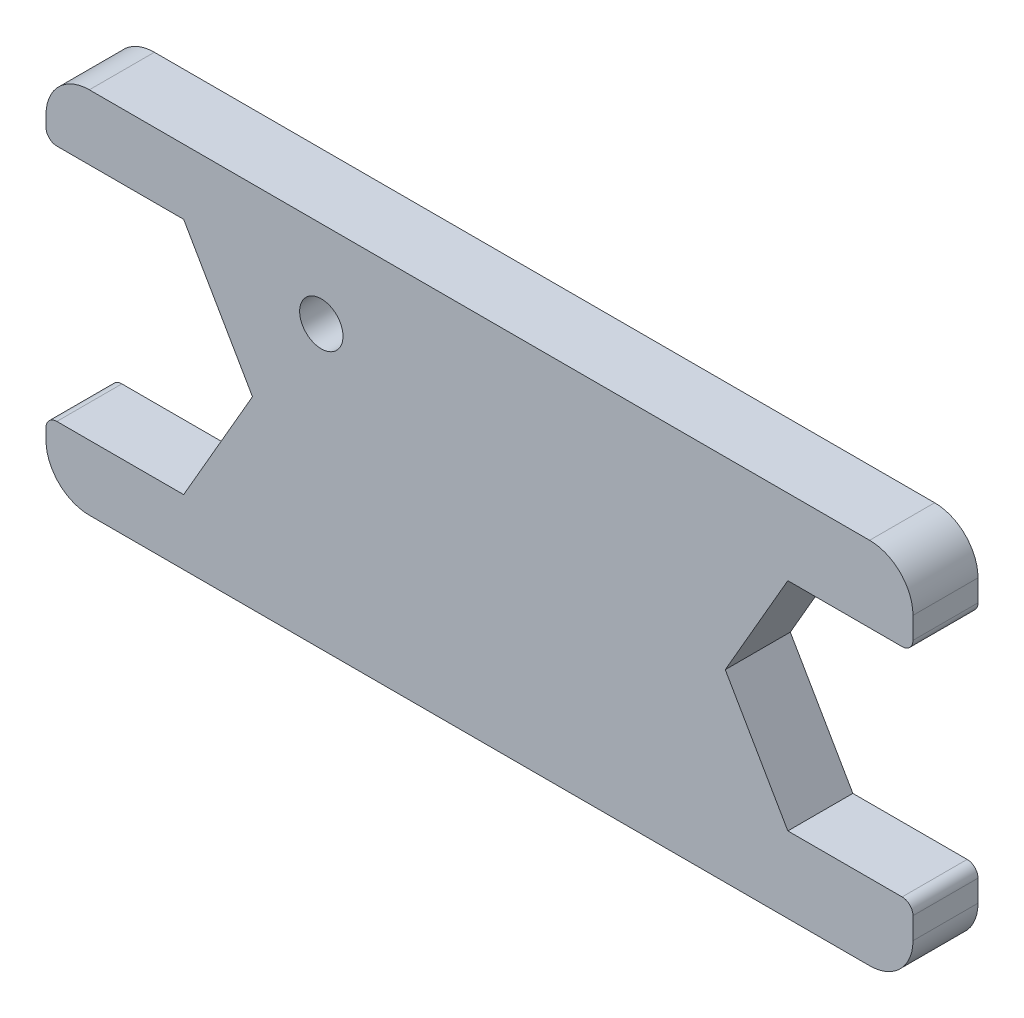
ISO-10303-21;
HEADER;
FILE_DESCRIPTION(('STEP AP214'),'2;1');
FILE_NAME('part.step','',(''),(''),'','','');
FILE_SCHEMA(('AUTOMOTIVE_DESIGN { 1 0 10303 214 1 1 1 1 }'));
ENDSEC;
DATA;
#1=APPLICATION_CONTEXT('core data for automotive mechanical design processes');
#2=APPLICATION_PROTOCOL_DEFINITION('international standard','automotive_design',2000,#1);
#3=PRODUCT_CONTEXT('',#1,'mechanical');
#4=PRODUCT('Part','Part','',(#3));
#5=PRODUCT_RELATED_PRODUCT_CATEGORY('part','',(#4));
#6=PRODUCT_DEFINITION_FORMATION('','',#4);
#7=PRODUCT_DEFINITION_CONTEXT('part definition',#1,'design');
#8=PRODUCT_DEFINITION('design','',#6,#7);
#9=PRODUCT_DEFINITION_SHAPE('','',#8);
#10=(LENGTH_UNIT() NAMED_UNIT(*) SI_UNIT(.MILLI.,.METRE.));
#11=(NAMED_UNIT(*) PLANE_ANGLE_UNIT() SI_UNIT($,.RADIAN.));
#12=(NAMED_UNIT(*) SI_UNIT($,.STERADIAN.) SOLID_ANGLE_UNIT());
#13=UNCERTAINTY_MEASURE_WITH_UNIT(LENGTH_MEASURE(1.E-05),#10,'distance_accuracy_value','');
#14=(GEOMETRIC_REPRESENTATION_CONTEXT(3) GLOBAL_UNCERTAINTY_ASSIGNED_CONTEXT((#13)) GLOBAL_UNIT_ASSIGNED_CONTEXT((#10,
#11,#12)) REPRESENTATION_CONTEXT('',''));
#15=CARTESIAN_POINT('',(0.,0.,0.));
#16=DIRECTION('',(0.,0.,1.));
#17=DIRECTION('',(1.,0.,0.));
#18=AXIS2_PLACEMENT_3D('',#15,#16,#17);
#19=CARTESIAN_POINT('',(0.,-5.,3.));
#20=DIRECTION('',(0.,1.,0.));
#21=DIRECTION('',(-1.,0.,0.));
#22=AXIS2_PLACEMENT_3D('',#19,#20,#21);
#23=PLANE('',#22);
#24=DIRECTION('',(1.,0.,0.));
#25=VECTOR('',#24,1.);
#26=CARTESIAN_POINT('',(0.,-5.,3.));
#27=LINE('',#26,#25);
#28=CARTESIAN_POINT('',(31.0510708275608,-5.,3.));
#29=VERTEX_POINT('',#28);
#30=CARTESIAN_POINT('',(36.3245735194571,-5.,3.));
#31=VERTEX_POINT('',#30);
#32=EDGE_CURVE('E199',#29,#31,#27,.T.);
#33=ORIENTED_EDGE('',*,*,#32,.T.);
#34=DIRECTION('',(0.,0.,-1.));
#35=VECTOR('',#34,1.);
#36=CARTESIAN_POINT('',(36.3245735194571,-5.,0.));
#37=LINE('',#36,#35);
#38=CARTESIAN_POINT('',(36.3245735194571,-5.,0.));
#39=VERTEX_POINT('',#38);
#40=EDGE_CURVE('E208',#31,#39,#37,.T.);
#41=ORIENTED_EDGE('',*,*,#40,.T.);
#42=DIRECTION('',(1.,0.,0.));
#43=VECTOR('',#42,1.);
#44=CARTESIAN_POINT('',(0.,-5.,0.));
#45=LINE('',#44,#43);
#46=CARTESIAN_POINT('',(31.0510708275608,-5.,0.));
#47=VERTEX_POINT('',#46);
#48=EDGE_CURVE('E202',#47,#39,#45,.T.);
#49=ORIENTED_EDGE('',*,*,#48,.F.);
#50=DIRECTION('',(0.,0.,-1.));
#51=VECTOR('',#50,1.);
#52=CARTESIAN_POINT('',(31.0510708275608,-5.,3.));
#53=LINE('',#52,#51);
#54=EDGE_CURVE('E196',#29,#47,#53,.T.);
#55=ORIENTED_EDGE('',*,*,#54,.F.);
#56=EDGE_LOOP('',(#33,#41,#49,#55));
#57=FACE_BOUND('',#56,.T.);
#58=ADVANCED_FACE('F45',(#57),#23,.T.);
#59=CARTESIAN_POINT('',(21.1232396112095,12.1955080756888,3.));
#60=DIRECTION('',(0.866025403784439,0.5,0.));
#61=DIRECTION('',(-0.5,0.866025403784439,0.));
#62=AXIS2_PLACEMENT_3D('',#59,#60,#61);
#63=PLANE('',#62);
#64=DIRECTION('',(0.5,-0.866025403784439,0.));
#65=VECTOR('',#64,1.);
#66=CARTESIAN_POINT('',(21.1232396112095,12.1955080756888,0.));
#67=LINE('',#66,#65);
#68=CARTESIAN_POINT('',(28.1643194816127,0.,0.));
#69=VERTEX_POINT('',#68);
#70=EDGE_CURVE('E266',#69,#47,#67,.T.);
#71=ORIENTED_EDGE('',*,*,#70,.F.);
#72=DIRECTION('',(0.,0.,-1.));
#73=VECTOR('',#72,1.);
#74=CARTESIAN_POINT('',(28.1643194816127,0.,3.));
#75=LINE('',#74,#73);
#76=CARTESIAN_POINT('',(28.1643194816127,0.,3.));
#77=VERTEX_POINT('',#76);
#78=EDGE_CURVE('E209',#77,#69,#75,.T.);
#79=ORIENTED_EDGE('',*,*,#78,.F.);
#80=DIRECTION('',(0.5,-0.866025403784439,0.));
#81=VECTOR('',#80,1.);
#82=CARTESIAN_POINT('',(21.1232396112095,12.1955080756888,3.));
#83=LINE('',#82,#81);
#84=EDGE_CURVE('E215',#77,#29,#83,.T.);
#85=ORIENTED_EDGE('',*,*,#84,.T.);
#86=ORIENTED_EDGE('',*,*,#54,.T.);
#87=EDGE_LOOP('',(#71,#79,#85,#86));
#88=FACE_BOUND('',#87,.T.);
#89=ADVANCED_FACE('F222',(#88),#63,.T.);
#90=CARTESIAN_POINT('',(21.1232396112095,-12.1955080756888,3.));
#91=DIRECTION('',(0.866025403784439,-0.5,0.));
#92=DIRECTION('',(0.5,0.866025403784439,0.));
#93=AXIS2_PLACEMENT_3D('',#90,#91,#92);
#94=PLANE('',#93);
#95=DIRECTION('',(-0.5,-0.866025403784439,0.));
#96=VECTOR('',#95,1.);
#97=CARTESIAN_POINT('',(21.1232396112095,-12.1955080756888,0.));
#98=LINE('',#97,#96);
#99=CARTESIAN_POINT('',(31.0510708275608,4.99999999999999,0.));
#100=VERTEX_POINT('',#99);
#101=EDGE_CURVE('E270',#100,#69,#98,.T.);
#102=ORIENTED_EDGE('',*,*,#101,.F.);
#103=DIRECTION('',(0.,0.,-1.));
#104=VECTOR('',#103,1.);
#105=CARTESIAN_POINT('',(31.0510708275608,4.99999999999999,3.));
#106=LINE('',#105,#104);
#107=CARTESIAN_POINT('',(31.0510708275608,4.99999999999999,3.));
#108=VERTEX_POINT('',#107);
#109=EDGE_CURVE('E319',#108,#100,#106,.T.);
#110=ORIENTED_EDGE('',*,*,#109,.F.);
#111=DIRECTION('',(-0.5,-0.866025403784439,0.));
#112=VECTOR('',#111,1.);
#113=CARTESIAN_POINT('',(21.1232396112095,-12.1955080756888,3.));
#114=LINE('',#113,#112);
#115=EDGE_CURVE('E224',#108,#77,#114,.T.);
#116=ORIENTED_EDGE('',*,*,#115,.T.);
#117=ORIENTED_EDGE('',*,*,#78,.T.);
#118=EDGE_LOOP('',(#102,#110,#116,#117));
#119=FACE_BOUND('',#118,.T.);
#120=ADVANCED_FACE('F464',(#119),#94,.T.);
#121=CARTESIAN_POINT('',(0.,4.99999999999999,3.));
#122=DIRECTION('',(0.,-1.,0.));
#123=DIRECTION('',(0.,0.,-1.));
#124=AXIS2_PLACEMENT_3D('',#121,#122,#123);
#125=PLANE('',#124);
#126=DIRECTION('',(-1.,0.,0.));
#127=VECTOR('',#126,1.);
#128=CARTESIAN_POINT('',(0.,4.99999999999999,0.));
#129=LINE('',#128,#127);
#130=CARTESIAN_POINT('',(36.3245735194571,4.99999999999999,0.));
#131=VERTEX_POINT('',#130);
#132=EDGE_CURVE('E274',#131,#100,#129,.T.);
#133=ORIENTED_EDGE('',*,*,#132,.F.);
#134=DIRECTION('',(0.,0.,-1.));
#135=VECTOR('',#134,1.);
#136=CARTESIAN_POINT('',(36.3245735194571,4.99999999999999,3.));
#137=LINE('',#136,#135);
#138=CARTESIAN_POINT('',(36.3245735194571,4.99999999999999,3.));
#139=VERTEX_POINT('',#138);
#140=EDGE_CURVE('E360',#131,#139,#137,.F.);
#141=ORIENTED_EDGE('',*,*,#140,.T.);
#142=DIRECTION('',(-1.,0.,0.));
#143=VECTOR('',#142,1.);
#144=CARTESIAN_POINT('',(0.,4.99999999999999,3.));
#145=LINE('',#144,#143);
#146=EDGE_CURVE('E227',#139,#108,#145,.T.);
#147=ORIENTED_EDGE('',*,*,#146,.T.);
#148=ORIENTED_EDGE('',*,*,#109,.T.);
#149=EDGE_LOOP('',(#133,#141,#147,#148));
#150=FACE_BOUND('',#149,.T.);
#151=ADVANCED_FACE('F546',(#150),#125,.T.);
#152=CARTESIAN_POINT('',(36.8245735194571,0.,3.));
#153=DIRECTION('',(-1.,0.,0.));
#154=DIRECTION('',(0.,0.,1.));
#155=AXIS2_PLACEMENT_3D('',#152,#153,#154);
#156=PLANE('',#155);
#157=DIRECTION('',(0.,1.,0.));
#158=VECTOR('',#157,1.);
#159=CARTESIAN_POINT('',(36.8245735194571,0.,0.));
#160=LINE('',#159,#158);
#161=CARTESIAN_POINT('',(36.8245735194571,5.49999999999999,0.));
#162=VERTEX_POINT('',#161);
#163=CARTESIAN_POINT('',(36.8245735194571,6.5,0.));
#164=VERTEX_POINT('',#163);
#165=EDGE_CURVE('E277',#162,#164,#160,.T.);
#166=ORIENTED_EDGE('',*,*,#165,.T.);
#167=DIRECTION('',(0.,0.,-1.));
#168=VECTOR('',#167,1.);
#169=CARTESIAN_POINT('',(36.8245735194571,6.5,3.));
#170=LINE('',#169,#168);
#171=CARTESIAN_POINT('',(36.8245735194571,6.5,3.));
#172=VERTEX_POINT('',#171);
#173=EDGE_CURVE('E11',#164,#172,#170,.F.);
#174=ORIENTED_EDGE('',*,*,#173,.T.);
#175=DIRECTION('',(0.,1.,0.));
#176=VECTOR('',#175,1.);
#177=CARTESIAN_POINT('',(36.8245735194571,0.,3.));
#178=LINE('',#177,#176);
#179=CARTESIAN_POINT('',(36.8245735194571,5.49999999999999,3.));
#180=VERTEX_POINT('',#179);
#181=EDGE_CURVE('E233',#180,#172,#178,.T.);
#182=ORIENTED_EDGE('',*,*,#181,.F.);
#183=DIRECTION('',(0.,0.,-1.));
#184=VECTOR('',#183,1.);
#185=CARTESIAN_POINT('',(36.8245735194571,5.49999999999999,0.));
#186=LINE('',#185,#184);
#187=EDGE_CURVE('E356',#180,#162,#186,.T.);
#188=ORIENTED_EDGE('',*,*,#187,.T.);
#189=EDGE_LOOP('',(#166,#174,#182,#188));
#190=FACE_BOUND('',#189,.T.);
#191=ADVANCED_FACE('F455',(#190),#156,.F.);
#192=CARTESIAN_POINT('',(0.,8.5,3.));
#193=DIRECTION('',(0.,-1.,0.));
#194=DIRECTION('',(1.,0.,0.));
#195=AXIS2_PLACEMENT_3D('',#192,#193,#194);
#196=PLANE('',#195);
#197=DIRECTION('',(-1.,0.,0.));
#198=VECTOR('',#197,1.);
#199=CARTESIAN_POINT('',(0.,8.5,0.));
#200=LINE('',#199,#198);
#201=CARTESIAN_POINT('',(34.8245735194571,8.5,0.));
#202=VERTEX_POINT('',#201);
#203=CARTESIAN_POINT('',(-1.17542648054294,8.5,0.));
#204=VERTEX_POINT('',#203);
#205=EDGE_CURVE('E281',#202,#204,#200,.T.);
#206=ORIENTED_EDGE('',*,*,#205,.T.);
#207=DIRECTION('',(0.,0.,-1.));
#208=VECTOR('',#207,1.);
#209=CARTESIAN_POINT('',(-1.17542648054294,8.5,3.));
#210=LINE('',#209,#208);
#211=CARTESIAN_POINT('',(-1.17542648054294,8.5,3.));
#212=VERTEX_POINT('',#211);
#213=EDGE_CURVE('E397',#204,#212,#210,.F.);
#214=ORIENTED_EDGE('',*,*,#213,.T.);
#215=DIRECTION('',(-1.,0.,0.));
#216=VECTOR('',#215,1.);
#217=CARTESIAN_POINT('',(0.,8.5,3.));
#218=LINE('',#217,#216);
#219=CARTESIAN_POINT('',(34.8245735194571,8.5,3.));
#220=VERTEX_POINT('',#219);
#221=EDGE_CURVE('E237',#220,#212,#218,.T.);
#222=ORIENTED_EDGE('',*,*,#221,.F.);
#223=DIRECTION('',(0.,0.,-1.));
#224=VECTOR('',#223,1.);
#225=CARTESIAN_POINT('',(34.8245735194571,8.5,3.));
#226=LINE('',#225,#224);
#227=EDGE_CURVE('E393',#220,#202,#226,.T.);
#228=ORIENTED_EDGE('',*,*,#227,.T.);
#229=EDGE_LOOP('',(#206,#214,#222,#228));
#230=FACE_BOUND('',#229,.T.);
#231=ADVANCED_FACE('F533',(#230),#196,.F.);
#232=CARTESIAN_POINT('',(-3.17542648054294,0.,3.));
#233=DIRECTION('',(-1.,0.,0.));
#234=DIRECTION('',(0.,0.,1.));
#235=AXIS2_PLACEMENT_3D('',#232,#233,#234);
#236=PLANE('',#235);
#237=DIRECTION('',(0.,1.,0.));
#238=VECTOR('',#237,1.);
#239=CARTESIAN_POINT('',(-3.17542648054294,0.,3.));
#240=LINE('',#239,#238);
#241=CARTESIAN_POINT('',(-3.17542648054294,6.,3.));
#242=VERTEX_POINT('',#241);
#243=CARTESIAN_POINT('',(-3.17542648054294,6.5,3.));
#244=VERTEX_POINT('',#243);
#245=EDGE_CURVE('E241',#242,#244,#240,.T.);
#246=ORIENTED_EDGE('',*,*,#245,.T.);
#247=DIRECTION('',(0.,0.,-1.));
#248=VECTOR('',#247,1.);
#249=CARTESIAN_POINT('',(-3.17542648054294,6.5,0.));
#250=LINE('',#249,#248);
#251=CARTESIAN_POINT('',(-3.17542648054294,6.5,0.));
#252=VERTEX_POINT('',#251);
#253=EDGE_CURVE('E377',#244,#252,#250,.T.);
#254=ORIENTED_EDGE('',*,*,#253,.T.);
#255=DIRECTION('',(0.,1.,0.));
#256=VECTOR('',#255,1.);
#257=CARTESIAN_POINT('',(-3.17542648054294,0.,0.));
#258=LINE('',#257,#256);
#259=CARTESIAN_POINT('',(-3.17542648054294,6.,0.));
#260=VERTEX_POINT('',#259);
#261=EDGE_CURVE('E285',#260,#252,#258,.T.);
#262=ORIENTED_EDGE('',*,*,#261,.F.);
#263=DIRECTION('',(0.,0.,-1.));
#264=VECTOR('',#263,1.);
#265=CARTESIAN_POINT('',(-3.17542648054294,6.,3.));
#266=LINE('',#265,#264);
#267=EDGE_CURVE('E374',#260,#242,#266,.F.);
#268=ORIENTED_EDGE('',*,*,#267,.T.);
#269=EDGE_LOOP('',(#246,#254,#262,#268));
#270=FACE_BOUND('',#269,.T.);
#271=ADVANCED_FACE('F526',(#270),#236,.T.);
#272=CARTESIAN_POINT('',(0.,5.5,3.));
#273=DIRECTION('',(0.,-1.,0.));
#274=DIRECTION('',(0.,0.,-1.));
#275=AXIS2_PLACEMENT_3D('',#272,#273,#274);
#276=PLANE('',#275);
#277=DIRECTION('',(-1.,0.,0.));
#278=VECTOR('',#277,1.);
#279=CARTESIAN_POINT('',(0.,5.5,3.));
#280=LINE('',#279,#278);
#281=CARTESIAN_POINT('',(3.17542648054294,5.5,3.));
#282=VERTEX_POINT('',#281);
#283=CARTESIAN_POINT('',(-2.67542648054294,5.5,3.));
#284=VERTEX_POINT('',#283);
#285=EDGE_CURVE('E245',#282,#284,#280,.T.);
#286=ORIENTED_EDGE('',*,*,#285,.T.);
#287=DIRECTION('',(0.,0.,-1.));
#288=VECTOR('',#287,1.);
#289=CARTESIAN_POINT('',(-2.67542648054294,5.5,3.));
#290=LINE('',#289,#288);
#291=CARTESIAN_POINT('',(-2.67542648054294,5.5,0.));
#292=VERTEX_POINT('',#291);
#293=EDGE_CURVE('E370',#284,#292,#290,.T.);
#294=ORIENTED_EDGE('',*,*,#293,.T.);
#295=DIRECTION('',(-1.,0.,0.));
#296=VECTOR('',#295,1.);
#297=CARTESIAN_POINT('',(0.,5.5,0.));
#298=LINE('',#297,#296);
#299=CARTESIAN_POINT('',(3.17542648054294,5.5,0.));
#300=VERTEX_POINT('',#299);
#301=EDGE_CURVE('E289',#300,#292,#298,.T.);
#302=ORIENTED_EDGE('',*,*,#301,.F.);
#303=DIRECTION('',(0.,0.,-1.));
#304=VECTOR('',#303,1.);
#305=CARTESIAN_POINT('',(3.17542648054294,5.5,3.));
#306=LINE('',#305,#304);
#307=EDGE_CURVE('E316',#282,#300,#306,.T.);
#308=ORIENTED_EDGE('',*,*,#307,.F.);
#309=EDGE_LOOP('',(#286,#294,#302,#308));
#310=FACE_BOUND('',#309,.T.);
#311=ADVANCED_FACE('F520',(#310),#276,.T.);
#312=CARTESIAN_POINT('',(4.76313972081441,2.75,3.));
#313=DIRECTION('',(-0.866025403784438,-0.5,0.));
#314=DIRECTION('',(0.5,-0.866025403784439,0.));
#315=AXIS2_PLACEMENT_3D('',#312,#313,#314);
#316=PLANE('',#315);
#317=DIRECTION('',(-0.5,0.866025403784439,0.));
#318=VECTOR('',#317,1.);
#319=CARTESIAN_POINT('',(4.76313972081441,2.75,0.));
#320=LINE('',#319,#318);
#321=CARTESIAN_POINT('',(6.35085296108588,0.,0.));
#322=VERTEX_POINT('',#321);
#323=EDGE_CURVE('E294',#322,#300,#320,.T.);
#324=ORIENTED_EDGE('',*,*,#323,.F.);
#325=DIRECTION('',(0.,0.,-1.));
#326=VECTOR('',#325,1.);
#327=CARTESIAN_POINT('',(6.35085296108588,0.,3.));
#328=LINE('',#327,#326);
#329=CARTESIAN_POINT('',(6.35085296108588,0.,3.));
#330=VERTEX_POINT('',#329);
#331=EDGE_CURVE('E313',#330,#322,#328,.T.);
#332=ORIENTED_EDGE('',*,*,#331,.F.);
#333=DIRECTION('',(-0.5,0.866025403784439,0.));
#334=VECTOR('',#333,1.);
#335=CARTESIAN_POINT('',(4.76313972081441,2.75,3.));
#336=LINE('',#335,#334);
#337=EDGE_CURVE('E250',#330,#282,#336,.T.);
#338=ORIENTED_EDGE('',*,*,#337,.T.);
#339=ORIENTED_EDGE('',*,*,#307,.T.);
#340=EDGE_LOOP('',(#324,#332,#338,#339));
#341=FACE_BOUND('',#340,.T.);
#342=ADVANCED_FACE('F516',(#341),#316,.T.);
#343=CARTESIAN_POINT('',(4.76313972081441,-2.75,3.));
#344=DIRECTION('',(-0.866025403784439,0.5,0.));
#345=DIRECTION('',(-0.5,-0.866025403784439,0.));
#346=AXIS2_PLACEMENT_3D('',#343,#344,#345);
#347=PLANE('',#346);
#348=DIRECTION('',(0.5,0.866025403784439,0.));
#349=VECTOR('',#348,1.);
#350=CARTESIAN_POINT('',(4.76313972081441,-2.75,0.));
#351=LINE('',#350,#349);
#352=CARTESIAN_POINT('',(3.17542648054294,-5.5,0.));
#353=VERTEX_POINT('',#352);
#354=EDGE_CURVE('E298',#353,#322,#351,.T.);
#355=ORIENTED_EDGE('',*,*,#354,.F.);
#356=DIRECTION('',(0.,0.,-1.));
#357=VECTOR('',#356,1.);
#358=CARTESIAN_POINT('',(3.17542648054294,-5.5,3.));
#359=LINE('',#358,#357);
#360=CARTESIAN_POINT('',(3.17542648054294,-5.5,3.));
#361=VERTEX_POINT('',#360);
#362=EDGE_CURVE('E309',#361,#353,#359,.T.);
#363=ORIENTED_EDGE('',*,*,#362,.F.);
#364=DIRECTION('',(0.5,0.866025403784439,0.));
#365=VECTOR('',#364,1.);
#366=CARTESIAN_POINT('',(4.76313972081441,-2.75,3.));
#367=LINE('',#366,#365);
#368=EDGE_CURVE('E254',#361,#330,#367,.T.);
#369=ORIENTED_EDGE('',*,*,#368,.T.);
#370=ORIENTED_EDGE('',*,*,#331,.T.);
#371=EDGE_LOOP('',(#355,#363,#369,#370));
#372=FACE_BOUND('',#371,.T.);
#373=ADVANCED_FACE('F512',(#372),#347,.T.);
#374=CARTESIAN_POINT('',(0.,-5.5,3.));
#375=DIRECTION('',(0.,1.,0.));
#376=DIRECTION('',(-1.,0.,0.));
#377=AXIS2_PLACEMENT_3D('',#374,#375,#376);
#378=PLANE('',#377);
#379=DIRECTION('',(1.,0.,0.));
#380=VECTOR('',#379,1.);
#381=CARTESIAN_POINT('',(0.,-5.5,0.));
#382=LINE('',#381,#380);
#383=CARTESIAN_POINT('',(-2.67542648054294,-5.5,0.));
#384=VERTEX_POINT('',#383);
#385=EDGE_CURVE('E302',#384,#353,#382,.T.);
#386=ORIENTED_EDGE('',*,*,#385,.F.);
#387=DIRECTION('',(0.,0.,-1.));
#388=VECTOR('',#387,1.);
#389=CARTESIAN_POINT('',(-2.67542648054294,-5.5,3.));
#390=LINE('',#389,#388);
#391=CARTESIAN_POINT('',(-2.67542648054294,-5.5,3.));
#392=VERTEX_POINT('',#391);
#393=EDGE_CURVE('E367',#384,#392,#390,.F.);
#394=ORIENTED_EDGE('',*,*,#393,.T.);
#395=DIRECTION('',(1.,0.,0.));
#396=VECTOR('',#395,1.);
#397=CARTESIAN_POINT('',(0.,-5.5,3.));
#398=LINE('',#397,#396);
#399=EDGE_CURVE('E258',#392,#361,#398,.T.);
#400=ORIENTED_EDGE('',*,*,#399,.T.);
#401=ORIENTED_EDGE('',*,*,#362,.T.);
#402=EDGE_LOOP('',(#386,#394,#400,#401));
#403=FACE_BOUND('',#402,.T.);
#404=ADVANCED_FACE('F506',(#403),#378,.T.);
#405=CARTESIAN_POINT('',(-3.17542648054294,-6.5,0.));
#406=VERTEX_POINT('',#405);
#407=CARTESIAN_POINT('',(-3.17542648054294,-6.,0.));
#408=VERTEX_POINT('',#407);
#409=EDGE_CURVE('E290',#406,#408,#258,.T.);
#410=ORIENTED_EDGE('',*,*,#409,.F.);
#411=DIRECTION('',(0.,0.,-1.));
#412=VECTOR('',#411,1.);
#413=CARTESIAN_POINT('',(-3.17542648054294,-6.5,3.));
#414=LINE('',#413,#412);
#415=CARTESIAN_POINT('',(-3.17542648054294,-6.5,3.));
#416=VERTEX_POINT('',#415);
#417=EDGE_CURVE('E417',#406,#416,#414,.F.);
#418=ORIENTED_EDGE('',*,*,#417,.T.);
#419=CARTESIAN_POINT('',(-3.17542648054294,-6.,3.));
#420=VERTEX_POINT('',#419);
#421=EDGE_CURVE('E246',#416,#420,#240,.T.);
#422=ORIENTED_EDGE('',*,*,#421,.T.);
#423=DIRECTION('',(0.,0.,-1.));
#424=VECTOR('',#423,1.);
#425=CARTESIAN_POINT('',(-3.17542648054294,-6.,3.));
#426=LINE('',#425,#424);
#427=EDGE_CURVE('E363',#420,#408,#426,.T.);
#428=ORIENTED_EDGE('',*,*,#427,.T.);
#429=EDGE_LOOP('',(#410,#418,#422,#428));
#430=FACE_BOUND('',#429,.T.);
#431=ADVANCED_FACE('F500',(#430),#236,.T.);
#432=CARTESIAN_POINT('',(0.,-8.5,3.));
#433=DIRECTION('',(0.,-1.,0.));
#434=DIRECTION('',(0.,0.,-1.));
#435=AXIS2_PLACEMENT_3D('',#432,#433,#434);
#436=PLANE('',#435);
#437=DIRECTION('',(-1.,0.,0.));
#438=VECTOR('',#437,1.);
#439=CARTESIAN_POINT('',(0.,-8.5,3.));
#440=LINE('',#439,#438);
#441=CARTESIAN_POINT('',(34.8245735194571,-8.5,3.));
#442=VERTEX_POINT('',#441);
#443=CARTESIAN_POINT('',(-1.17542648054294,-8.5,3.));
#444=VERTEX_POINT('',#443);
#445=EDGE_CURVE('E261',#442,#444,#440,.T.);
#446=ORIENTED_EDGE('',*,*,#445,.T.);
#447=DIRECTION('',(0.,0.,-1.));
#448=VECTOR('',#447,1.);
#449=CARTESIAN_POINT('',(-1.17542648054294,-8.5,3.));
#450=LINE('',#449,#448);
#451=CARTESIAN_POINT('',(-1.17542648054294,-8.5,0.));
#452=VERTEX_POINT('',#451);
#453=EDGE_CURVE('E413',#444,#452,#450,.T.);
#454=ORIENTED_EDGE('',*,*,#453,.T.);
#455=DIRECTION('',(-1.,0.,0.));
#456=VECTOR('',#455,1.);
#457=CARTESIAN_POINT('',(0.,-8.5,0.));
#458=LINE('',#457,#456);
#459=CARTESIAN_POINT('',(34.8245735194571,-8.5,0.));
#460=VERTEX_POINT('',#459);
#461=EDGE_CURVE('E305',#460,#452,#458,.T.);
#462=ORIENTED_EDGE('',*,*,#461,.F.);
#463=DIRECTION('',(0.,0.,-1.));
#464=VECTOR('',#463,1.);
#465=CARTESIAN_POINT('',(34.8245735194571,-8.5,3.));
#466=LINE('',#465,#464);
#467=EDGE_CURVE('E68',#460,#442,#466,.F.);
#468=ORIENTED_EDGE('',*,*,#467,.T.);
#469=EDGE_LOOP('',(#446,#454,#462,#468));
#470=FACE_BOUND('',#469,.T.);
#471=ADVANCED_FACE('F453',(#470),#436,.T.);
#472=CARTESIAN_POINT('',(36.8245735194571,-6.5,3.));
#473=VERTEX_POINT('',#472);
#474=CARTESIAN_POINT('',(36.8245735194571,-5.5,3.));
#475=VERTEX_POINT('',#474);
#476=EDGE_CURVE('E238',#473,#475,#178,.T.);
#477=ORIENTED_EDGE('',*,*,#476,.F.);
#478=DIRECTION('',(0.,0.,-1.));
#479=VECTOR('',#478,1.);
#480=CARTESIAN_POINT('',(36.8245735194571,-6.5,0.));
#481=LINE('',#480,#479);
#482=CARTESIAN_POINT('',(36.8245735194571,-6.5,0.));
#483=VERTEX_POINT('',#482);
#484=EDGE_CURVE('E54',#473,#483,#481,.T.);
#485=ORIENTED_EDGE('',*,*,#484,.T.);
#486=CARTESIAN_POINT('',(36.8245735194571,-5.5,0.));
#487=VERTEX_POINT('',#486);
#488=EDGE_CURVE('E220',#483,#487,#160,.T.);
#489=ORIENTED_EDGE('',*,*,#488,.T.);
#490=DIRECTION('',(0.,0.,-1.));
#491=VECTOR('',#490,1.);
#492=CARTESIAN_POINT('',(36.8245735194571,-5.5,3.));
#493=LINE('',#492,#491);
#494=EDGE_CURVE('E340',#487,#475,#493,.F.);
#495=ORIENTED_EDGE('',*,*,#494,.T.);
#496=EDGE_LOOP('',(#477,#485,#489,#495));
#497=FACE_BOUND('',#496,.T.);
#498=ADVANCED_FACE('F425',(#497),#156,.F.);
#499=CARTESIAN_POINT('',(0.,0.,3.));
#500=DIRECTION('',(0.,0.,1.));
#501=DIRECTION('',(1.,0.,0.));
#502=AXIS2_PLACEMENT_3D('',#499,#500,#501);
#503=PLANE('',#502);
#504=CARTESIAN_POINT('',(9.52627944162883,4.5,3.));
#505=DIRECTION('',(0.,0.,1.));
#506=DIRECTION('',(1.,0.,0.));
#507=AXIS2_PLACEMENT_3D('',#504,#505,#506);
#508=CIRCLE('',#507,1.);
#509=CARTESIAN_POINT('',(10.5262794416288,4.5,3.));
#510=VERTEX_POINT('',#509);
#511=EDGE_CURVE('E436',#510,#510,#508,.T.);
#512=ORIENTED_EDGE('',*,*,#511,.F.);
#513=EDGE_LOOP('',(#512));
#514=FACE_BOUND('',#513,.T.);
#515=ORIENTED_EDGE('',*,*,#221,.T.);
#516=CARTESIAN_POINT('',(-1.17542648054294,6.5,3.));
#517=DIRECTION('',(0.,0.,1.));
#518=DIRECTION('',(1.,0.,0.));
#519=AXIS2_PLACEMENT_3D('',#516,#517,#518);
#520=CIRCLE('',#519,2.);
#521=EDGE_CURVE('E408',#212,#244,#520,.T.);
#522=ORIENTED_EDGE('',*,*,#521,.T.);
#523=ORIENTED_EDGE('',*,*,#245,.F.);
#524=CARTESIAN_POINT('',(-2.67542648054294,6.,3.));
#525=DIRECTION('',(0.,0.,1.));
#526=DIRECTION('',(1.,0.,0.));
#527=AXIS2_PLACEMENT_3D('',#524,#525,#526);
#528=CIRCLE('',#527,0.5);
#529=EDGE_CURVE('E344',#242,#284,#528,.T.);
#530=ORIENTED_EDGE('',*,*,#529,.T.);
#531=ORIENTED_EDGE('',*,*,#285,.F.);
#532=ORIENTED_EDGE('',*,*,#337,.F.);
#533=ORIENTED_EDGE('',*,*,#368,.F.);
#534=ORIENTED_EDGE('',*,*,#399,.F.);
#535=CARTESIAN_POINT('',(-2.67542648054294,-6.,3.));
#536=DIRECTION('',(0.,0.,1.));
#537=DIRECTION('',(1.,0.,0.));
#538=AXIS2_PLACEMENT_3D('',#535,#536,#537);
#539=CIRCLE('',#538,0.5);
#540=EDGE_CURVE('E347',#392,#420,#539,.T.);
#541=ORIENTED_EDGE('',*,*,#540,.T.);
#542=ORIENTED_EDGE('',*,*,#421,.F.);
#543=CARTESIAN_POINT('',(-1.17542648054294,-6.5,3.));
#544=DIRECTION('',(0.,0.,1.));
#545=DIRECTION('',(1.,0.,0.));
#546=AXIS2_PLACEMENT_3D('',#543,#544,#545);
#547=CIRCLE('',#546,2.);
#548=EDGE_CURVE('E61',#416,#444,#547,.T.);
#549=ORIENTED_EDGE('',*,*,#548,.T.);
#550=ORIENTED_EDGE('',*,*,#445,.F.);
#551=CARTESIAN_POINT('',(34.8245735194571,-6.5,3.));
#552=DIRECTION('',(0.,0.,1.));
#553=DIRECTION('',(1.,0.,0.));
#554=AXIS2_PLACEMENT_3D('',#551,#552,#553);
#555=CIRCLE('',#554,2.);
#556=EDGE_CURVE('E403',#442,#473,#555,.T.);
#557=ORIENTED_EDGE('',*,*,#556,.T.);
#558=ORIENTED_EDGE('',*,*,#476,.T.);
#559=CARTESIAN_POINT('',(36.3245735194571,-5.5,3.));
#560=DIRECTION('',(0.,0.,1.));
#561=DIRECTION('',(1.,0.,0.));
#562=AXIS2_PLACEMENT_3D('',#559,#560,#561);
#563=CIRCLE('',#562,0.5);
#564=EDGE_CURVE('E218',#475,#31,#563,.T.);
#565=ORIENTED_EDGE('',*,*,#564,.T.);
#566=ORIENTED_EDGE('',*,*,#32,.F.);
#567=ORIENTED_EDGE('',*,*,#84,.F.);
#568=ORIENTED_EDGE('',*,*,#115,.F.);
#569=ORIENTED_EDGE('',*,*,#146,.F.);
#570=CARTESIAN_POINT('',(36.3245735194571,5.49999999999999,3.));
#571=DIRECTION('',(0.,0.,1.));
#572=DIRECTION('',(1.,0.,0.));
#573=AXIS2_PLACEMENT_3D('',#570,#571,#572);
#574=CIRCLE('',#573,0.5);
#575=EDGE_CURVE('E351',#139,#180,#574,.T.);
#576=ORIENTED_EDGE('',*,*,#575,.T.);
#577=ORIENTED_EDGE('',*,*,#181,.T.);
#578=CARTESIAN_POINT('',(34.8245735194571,6.5,3.));
#579=DIRECTION('',(0.,0.,1.));
#580=DIRECTION('',(1.,0.,0.));
#581=AXIS2_PLACEMENT_3D('',#578,#579,#580);
#582=CIRCLE('',#581,2.);
#583=EDGE_CURVE('E400',#172,#220,#582,.T.);
#584=ORIENTED_EDGE('',*,*,#583,.T.);
#585=EDGE_LOOP('',(#515,#522,#523,#530,#531,#532,#533,#534,#541,#542,#549,#550,#557,#558,#565,
#566,#567,#568,#569,#576,#577,#584));
#586=FACE_BOUND('',#585,.T.);
#587=ADVANCED_FACE('F213',(#514,#586),#503,.T.);
#588=CARTESIAN_POINT('',(0.,0.,0.));
#589=DIRECTION('',(0.,0.,1.));
#590=DIRECTION('',(1.,0.,0.));
#591=AXIS2_PLACEMENT_3D('',#588,#589,#590);
#592=PLANE('',#591);
#593=CARTESIAN_POINT('',(9.52627944162883,4.5,0.));
#594=DIRECTION('',(0.,0.,1.));
#595=DIRECTION('',(1.,0.,0.));
#596=AXIS2_PLACEMENT_3D('',#593,#594,#595);
#597=CIRCLE('',#596,1.);
#598=CARTESIAN_POINT('',(10.5262794416288,4.5,0.));
#599=VERTEX_POINT('',#598);
#600=EDGE_CURVE('E267',#599,#599,#597,.F.);
#601=ORIENTED_EDGE('',*,*,#600,.F.);
#602=EDGE_LOOP('',(#601));
#603=FACE_BOUND('',#602,.T.);
#604=ORIENTED_EDGE('',*,*,#261,.T.);
#605=CARTESIAN_POINT('',(-1.17542648054294,6.5,0.));
#606=DIRECTION('',(0.,0.,1.));
#607=DIRECTION('',(1.,0.,0.));
#608=AXIS2_PLACEMENT_3D('',#605,#606,#607);
#609=CIRCLE('',#608,2.);
#610=EDGE_CURVE('E390',#252,#204,#609,.F.);
#611=ORIENTED_EDGE('',*,*,#610,.T.);
#612=ORIENTED_EDGE('',*,*,#205,.F.);
#613=CARTESIAN_POINT('',(34.8245735194571,6.5,0.));
#614=DIRECTION('',(0.,0.,1.));
#615=DIRECTION('',(1.,0.,0.));
#616=AXIS2_PLACEMENT_3D('',#613,#614,#615);
#617=CIRCLE('',#616,2.);
#618=EDGE_CURVE('E381',#202,#164,#617,.F.);
#619=ORIENTED_EDGE('',*,*,#618,.T.);
#620=ORIENTED_EDGE('',*,*,#165,.F.);
#621=CARTESIAN_POINT('',(36.3245735194571,5.49999999999999,0.));
#622=DIRECTION('',(0.,0.,1.));
#623=DIRECTION('',(1.,0.,0.));
#624=AXIS2_PLACEMENT_3D('',#621,#622,#623);
#625=CIRCLE('',#624,0.5);
#626=EDGE_CURVE('E333',#162,#131,#625,.F.);
#627=ORIENTED_EDGE('',*,*,#626,.T.);
#628=ORIENTED_EDGE('',*,*,#132,.T.);
#629=ORIENTED_EDGE('',*,*,#101,.T.);
#630=ORIENTED_EDGE('',*,*,#70,.T.);
#631=ORIENTED_EDGE('',*,*,#48,.T.);
#632=CARTESIAN_POINT('',(36.3245735194571,-5.5,0.));
#633=DIRECTION('',(0.,0.,1.));
#634=DIRECTION('',(1.,0.,0.));
#635=AXIS2_PLACEMENT_3D('',#632,#633,#634);
#636=CIRCLE('',#635,0.5);
#637=EDGE_CURVE('E336',#39,#487,#636,.F.);
#638=ORIENTED_EDGE('',*,*,#637,.T.);
#639=ORIENTED_EDGE('',*,*,#488,.F.);
#640=CARTESIAN_POINT('',(34.8245735194571,-6.5,0.));
#641=DIRECTION('',(0.,0.,1.));
#642=DIRECTION('',(1.,0.,0.));
#643=AXIS2_PLACEMENT_3D('',#640,#641,#642);
#644=CIRCLE('',#643,2.);
#645=EDGE_CURVE('E384',#483,#460,#644,.F.);
#646=ORIENTED_EDGE('',*,*,#645,.T.);
#647=ORIENTED_EDGE('',*,*,#461,.T.);
#648=CARTESIAN_POINT('',(-1.17542648054294,-6.5,0.));
#649=DIRECTION('',(0.,0.,1.));
#650=DIRECTION('',(1.,0.,0.));
#651=AXIS2_PLACEMENT_3D('',#648,#649,#650);
#652=CIRCLE('',#651,2.);
#653=EDGE_CURVE('E387',#452,#406,#652,.F.);
#654=ORIENTED_EDGE('',*,*,#653,.T.);
#655=ORIENTED_EDGE('',*,*,#409,.T.);
#656=CARTESIAN_POINT('',(-2.67542648054294,-6.,0.));
#657=DIRECTION('',(0.,0.,1.));
#658=DIRECTION('',(1.,0.,0.));
#659=AXIS2_PLACEMENT_3D('',#656,#657,#658);
#660=CIRCLE('',#659,0.5);
#661=EDGE_CURVE('E330',#408,#384,#660,.F.);
#662=ORIENTED_EDGE('',*,*,#661,.T.);
#663=ORIENTED_EDGE('',*,*,#385,.T.);
#664=ORIENTED_EDGE('',*,*,#354,.T.);
#665=ORIENTED_EDGE('',*,*,#323,.T.);
#666=ORIENTED_EDGE('',*,*,#301,.T.);
#667=CARTESIAN_POINT('',(-2.67542648054294,6.,0.));
#668=DIRECTION('',(0.,0.,1.));
#669=DIRECTION('',(1.,0.,0.));
#670=AXIS2_PLACEMENT_3D('',#667,#668,#669);
#671=CIRCLE('',#670,0.5);
#672=EDGE_CURVE('E327',#292,#260,#671,.F.);
#673=ORIENTED_EDGE('',*,*,#672,.T.);
#674=EDGE_LOOP('',(#604,#611,#612,#619,#620,#627,#628,#629,#630,#631,#638,#639,#646,#647,#654,
#655,#662,#663,#664,#665,#666,#673));
#675=FACE_BOUND('',#674,.T.);
#676=ADVANCED_FACE('F429',(#603,#675),#592,.F.);
#677=CARTESIAN_POINT('',(36.3245735194571,-5.5,3.));
#678=DIRECTION('',(0.,0.,1.));
#679=DIRECTION('',(1.,0.,0.));
#680=AXIS2_PLACEMENT_3D('',#677,#678,#679);
#681=CYLINDRICAL_SURFACE('',#680,0.5);
#682=ORIENTED_EDGE('',*,*,#564,.F.);
#683=ORIENTED_EDGE('',*,*,#494,.F.);
#684=ORIENTED_EDGE('',*,*,#637,.F.);
#685=ORIENTED_EDGE('',*,*,#40,.F.);
#686=EDGE_LOOP('',(#682,#683,#684,#685));
#687=FACE_BOUND('',#686,.T.);
#688=ADVANCED_FACE('F449',(#687),#681,.T.);
#689=CARTESIAN_POINT('',(36.3245735194571,5.49999999999999,3.));
#690=DIRECTION('',(0.,0.,1.));
#691=DIRECTION('',(1.,0.,0.));
#692=AXIS2_PLACEMENT_3D('',#689,#690,#691);
#693=CYLINDRICAL_SURFACE('',#692,0.5);
#694=ORIENTED_EDGE('',*,*,#575,.F.);
#695=ORIENTED_EDGE('',*,*,#140,.F.);
#696=ORIENTED_EDGE('',*,*,#626,.F.);
#697=ORIENTED_EDGE('',*,*,#187,.F.);
#698=EDGE_LOOP('',(#694,#695,#696,#697));
#699=FACE_BOUND('',#698,.T.);
#700=ADVANCED_FACE('F470',(#699),#693,.T.);
#701=CARTESIAN_POINT('',(-2.67542648054294,-6.,3.));
#702=DIRECTION('',(0.,0.,-1.));
#703=DIRECTION('',(-1.,0.,0.));
#704=AXIS2_PLACEMENT_3D('',#701,#702,#703);
#705=CYLINDRICAL_SURFACE('',#704,0.5);
#706=ORIENTED_EDGE('',*,*,#540,.F.);
#707=ORIENTED_EDGE('',*,*,#393,.F.);
#708=ORIENTED_EDGE('',*,*,#661,.F.);
#709=ORIENTED_EDGE('',*,*,#427,.F.);
#710=EDGE_LOOP('',(#706,#707,#708,#709));
#711=FACE_BOUND('',#710,.T.);
#712=ADVANCED_FACE('F474',(#711),#705,.T.);
#713=CARTESIAN_POINT('',(-2.67542648054294,6.,3.));
#714=DIRECTION('',(0.,0.,-1.));
#715=DIRECTION('',(-1.,0.,0.));
#716=AXIS2_PLACEMENT_3D('',#713,#714,#715);
#717=CYLINDRICAL_SURFACE('',#716,0.5);
#718=ORIENTED_EDGE('',*,*,#529,.F.);
#719=ORIENTED_EDGE('',*,*,#267,.F.);
#720=ORIENTED_EDGE('',*,*,#672,.F.);
#721=ORIENTED_EDGE('',*,*,#293,.F.);
#722=EDGE_LOOP('',(#718,#719,#720,#721));
#723=FACE_BOUND('',#722,.T.);
#724=ADVANCED_FACE('F478',(#723),#717,.T.);
#725=CARTESIAN_POINT('',(-1.17542648054294,6.5,3.));
#726=DIRECTION('',(0.,0.,1.));
#727=DIRECTION('',(1.,0.,0.));
#728=AXIS2_PLACEMENT_3D('',#725,#726,#727);
#729=CYLINDRICAL_SURFACE('',#728,2.);
#730=ORIENTED_EDGE('',*,*,#521,.F.);
#731=ORIENTED_EDGE('',*,*,#213,.F.);
#732=ORIENTED_EDGE('',*,*,#610,.F.);
#733=ORIENTED_EDGE('',*,*,#253,.F.);
#734=EDGE_LOOP('',(#730,#731,#732,#733));
#735=FACE_BOUND('',#734,.T.);
#736=ADVANCED_FACE('F482',(#735),#729,.T.);
#737=CARTESIAN_POINT('',(-1.17542648054294,-6.5,3.));
#738=DIRECTION('',(0.,0.,-1.));
#739=DIRECTION('',(-1.,0.,0.));
#740=AXIS2_PLACEMENT_3D('',#737,#738,#739);
#741=CYLINDRICAL_SURFACE('',#740,2.);
#742=ORIENTED_EDGE('',*,*,#548,.F.);
#743=ORIENTED_EDGE('',*,*,#417,.F.);
#744=ORIENTED_EDGE('',*,*,#653,.F.);
#745=ORIENTED_EDGE('',*,*,#453,.F.);
#746=EDGE_LOOP('',(#742,#743,#744,#745));
#747=FACE_BOUND('',#746,.T.);
#748=ADVANCED_FACE('F486',(#747),#741,.T.);
#749=CARTESIAN_POINT('',(34.8245735194571,-6.5,3.));
#750=DIRECTION('',(0.,0.,1.));
#751=DIRECTION('',(1.,0.,0.));
#752=AXIS2_PLACEMENT_3D('',#749,#750,#751);
#753=CYLINDRICAL_SURFACE('',#752,2.);
#754=ORIENTED_EDGE('',*,*,#556,.F.);
#755=ORIENTED_EDGE('',*,*,#467,.F.);
#756=ORIENTED_EDGE('',*,*,#645,.F.);
#757=ORIENTED_EDGE('',*,*,#484,.F.);
#758=EDGE_LOOP('',(#754,#755,#756,#757));
#759=FACE_BOUND('',#758,.T.);
#760=ADVANCED_FACE('F489',(#759),#753,.T.);
#761=CARTESIAN_POINT('',(34.8245735194571,6.5,3.));
#762=DIRECTION('',(0.,0.,-1.));
#763=DIRECTION('',(-1.,0.,0.));
#764=AXIS2_PLACEMENT_3D('',#761,#762,#763);
#765=CYLINDRICAL_SURFACE('',#764,2.);
#766=ORIENTED_EDGE('',*,*,#583,.F.);
#767=ORIENTED_EDGE('',*,*,#173,.F.);
#768=ORIENTED_EDGE('',*,*,#618,.F.);
#769=ORIENTED_EDGE('',*,*,#227,.F.);
#770=EDGE_LOOP('',(#766,#767,#768,#769));
#771=FACE_BOUND('',#770,.T.);
#772=ADVANCED_FACE('F47',(#771),#765,.T.);
#773=CARTESIAN_POINT('',(9.52627944162883,4.5,-2.82842712474619));
#774=DIRECTION('',(0.,0.,1.));
#775=DIRECTION('',(1.,0.,0.));
#776=AXIS2_PLACEMENT_3D('',#773,#774,#775);
#777=CYLINDRICAL_SURFACE('',#776,1.);
#778=ORIENTED_EDGE('',*,*,#600,.T.);
#779=EDGE_LOOP('',(#778));
#780=FACE_BOUND('',#779,.T.);
#781=ORIENTED_EDGE('',*,*,#511,.T.);
#782=EDGE_LOOP('',(#781));
#783=FACE_BOUND('',#782,.T.);
#784=ADVANCED_FACE('F441',(#780,#783),#777,.F.);
#785=CLOSED_SHELL('',(#58,#89,#120,#151,#191,#231,#271,#311,#342,#373,#404,#431,#471,#498,#587,
#676,#688,#700,#712,#724,#736,#748,#760,#772,#784));
#786=MANIFOLD_SOLID_BREP('B2',#785);
#787=ADVANCED_BREP_SHAPE_REPRESENTATION('',(#18,#786),#14);
#788=SHAPE_DEFINITION_REPRESENTATION(#9,#787);
ENDSEC;
END-ISO-10303-21;
